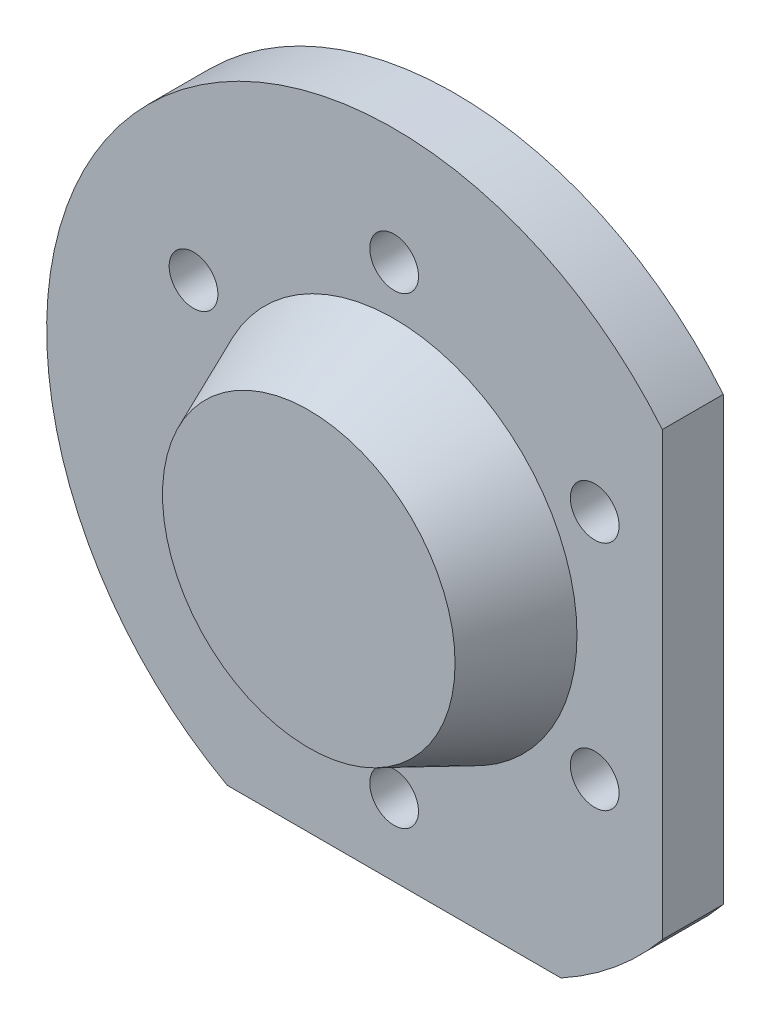
ISO-10303-21;
HEADER;
FILE_DESCRIPTION(('STEP AP214'),'2;1');
FILE_NAME('part.step','',(''),(''),'','','');
FILE_SCHEMA(('AUTOMOTIVE_DESIGN { 1 0 10303 214 1 1 1 1 }'));
ENDSEC;
DATA;
#1=APPLICATION_CONTEXT('core data for automotive mechanical design processes');
#2=APPLICATION_PROTOCOL_DEFINITION('international standard','automotive_design',2000,#1);
#3=PRODUCT_CONTEXT('',#1,'mechanical');
#4=PRODUCT('Part','Part','',(#3));
#5=PRODUCT_RELATED_PRODUCT_CATEGORY('part','',(#4));
#6=PRODUCT_DEFINITION_FORMATION('','',#4);
#7=PRODUCT_DEFINITION_CONTEXT('part definition',#1,'design');
#8=PRODUCT_DEFINITION('design','',#6,#7);
#9=PRODUCT_DEFINITION_SHAPE('','',#8);
#10=(LENGTH_UNIT() NAMED_UNIT(*) SI_UNIT(.MILLI.,.METRE.));
#11=(NAMED_UNIT(*) PLANE_ANGLE_UNIT() SI_UNIT($,.RADIAN.));
#12=(NAMED_UNIT(*) SI_UNIT($,.STERADIAN.) SOLID_ANGLE_UNIT());
#13=UNCERTAINTY_MEASURE_WITH_UNIT(LENGTH_MEASURE(1.E-05),#10,'distance_accuracy_value','');
#14=(GEOMETRIC_REPRESENTATION_CONTEXT(3) GLOBAL_UNCERTAINTY_ASSIGNED_CONTEXT((#13)) GLOBAL_UNIT_ASSIGNED_CONTEXT((#10,
#11,#12)) REPRESENTATION_CONTEXT('',''));
#15=CARTESIAN_POINT('',(0.,0.,0.));
#16=DIRECTION('',(0.,0.,1.));
#17=DIRECTION('',(1.,0.,0.));
#18=AXIS2_PLACEMENT_3D('',#15,#16,#17);
#19=CARTESIAN_POINT('',(0.,0.,0.));
#20=DIRECTION('',(0.,0.,1.));
#21=DIRECTION('',(1.,0.,0.));
#22=AXIS2_PLACEMENT_3D('',#19,#20,#21);
#23=PLANE('',#22);
#24=CARTESIAN_POINT('',(0.,0.,0.));
#25=DIRECTION('',(0.,0.,1.));
#26=DIRECTION('',(1.,0.,0.));
#27=AXIS2_PLACEMENT_3D('',#24,#25,#26);
#28=CIRCLE('',#27,28.5);
#29=CARTESIAN_POINT('',(22.,18.1176709319934,0.));
#30=VERTEX_POINT('',#29);
#31=CARTESIAN_POINT('',(-13.683932183404,-25.,0.));
#32=VERTEX_POINT('',#31);
#33=EDGE_CURVE('E107',#30,#32,#28,.T.);
#34=ORIENTED_EDGE('',*,*,#33,.T.);
#35=DIRECTION('',(1.,0.,0.));
#36=VECTOR('',#35,1.);
#37=CARTESIAN_POINT('',(-13.683932183404,-25.,0.));
#38=LINE('',#37,#36);
#39=CARTESIAN_POINT('',(13.683932183404,-25.,0.));
#40=VERTEX_POINT('',#39);
#41=EDGE_CURVE('E110',#32,#40,#38,.T.);
#42=ORIENTED_EDGE('',*,*,#41,.T.);
#43=CARTESIAN_POINT('',(0.,0.,0.));
#44=DIRECTION('',(0.,0.,1.));
#45=DIRECTION('',(1.,0.,0.));
#46=AXIS2_PLACEMENT_3D('',#43,#44,#45);
#47=CIRCLE('',#46,28.5);
#48=CARTESIAN_POINT('',(22.,-18.1176709319935,0.));
#49=VERTEX_POINT('',#48);
#50=EDGE_CURVE('E91',#40,#49,#47,.T.);
#51=ORIENTED_EDGE('',*,*,#50,.T.);
#52=DIRECTION('',(0.,1.,0.));
#53=VECTOR('',#52,1.);
#54=CARTESIAN_POINT('',(22.,-18.1176709319934,0.));
#55=LINE('',#54,#53);
#56=EDGE_CURVE('E102',#49,#30,#55,.T.);
#57=ORIENTED_EDGE('',*,*,#56,.T.);
#58=EDGE_LOOP('',(#34,#42,#51,#57));
#59=FACE_BOUND('',#58,.T.);
#60=CARTESIAN_POINT('',(0.,19.,0.));
#61=DIRECTION('',(0.,0.,1.));
#62=DIRECTION('',(1.,0.,0.));
#63=AXIS2_PLACEMENT_3D('',#60,#61,#62);
#64=CIRCLE('',#63,2.);
#65=CARTESIAN_POINT('',(2.,19.,0.));
#66=VERTEX_POINT('',#65);
#67=EDGE_CURVE('E166',#66,#66,#64,.T.);
#68=ORIENTED_EDGE('',*,*,#67,.F.);
#69=EDGE_LOOP('',(#68));
#70=FACE_BOUND('',#69,.T.);
#71=CARTESIAN_POINT('',(16.4544826719043,9.50000000000001,0.));
#72=DIRECTION('',(0.,0.,1.));
#73=DIRECTION('',(1.,0.,0.));
#74=AXIS2_PLACEMENT_3D('',#71,#72,#73);
#75=CIRCLE('',#74,2.);
#76=CARTESIAN_POINT('',(18.4544826719043,9.50000000000001,0.));
#77=VERTEX_POINT('',#76);
#78=EDGE_CURVE('E160',#77,#77,#75,.T.);
#79=ORIENTED_EDGE('',*,*,#78,.F.);
#80=EDGE_LOOP('',(#79));
#81=FACE_BOUND('',#80,.T.);
#82=CARTESIAN_POINT('',(16.4544826719043,-9.5,0.));
#83=DIRECTION('',(0.,0.,1.));
#84=DIRECTION('',(1.,0.,0.));
#85=AXIS2_PLACEMENT_3D('',#82,#83,#84);
#86=CIRCLE('',#85,2.);
#87=CARTESIAN_POINT('',(18.4544826719043,-9.5,0.));
#88=VERTEX_POINT('',#87);
#89=EDGE_CURVE('E154',#88,#88,#86,.T.);
#90=ORIENTED_EDGE('',*,*,#89,.F.);
#91=EDGE_LOOP('',(#90));
#92=FACE_BOUND('',#91,.T.);
#93=CARTESIAN_POINT('',(0.,-19.,0.));
#94=DIRECTION('',(0.,0.,1.));
#95=DIRECTION('',(1.,0.,0.));
#96=AXIS2_PLACEMENT_3D('',#93,#94,#95);
#97=CIRCLE('',#96,2.);
#98=CARTESIAN_POINT('',(2.,-19.,0.));
#99=VERTEX_POINT('',#98);
#100=EDGE_CURVE('E148',#99,#99,#97,.T.);
#101=ORIENTED_EDGE('',*,*,#100,.F.);
#102=EDGE_LOOP('',(#101));
#103=FACE_BOUND('',#102,.T.);
#104=CARTESIAN_POINT('',(-16.4544826719043,-9.50000000000001,0.));
#105=DIRECTION('',(0.,0.,1.));
#106=DIRECTION('',(1.,0.,0.));
#107=AXIS2_PLACEMENT_3D('',#104,#105,#106);
#108=CIRCLE('',#107,2.);
#109=CARTESIAN_POINT('',(-14.4544826719043,-9.50000000000001,0.));
#110=VERTEX_POINT('',#109);
#111=EDGE_CURVE('E142',#110,#110,#108,.T.);
#112=ORIENTED_EDGE('',*,*,#111,.F.);
#113=EDGE_LOOP('',(#112));
#114=FACE_BOUND('',#113,.T.);
#115=CARTESIAN_POINT('',(-16.4544826719043,9.49999999999999,0.));
#116=DIRECTION('',(0.,0.,1.));
#117=DIRECTION('',(1.,0.,0.));
#118=AXIS2_PLACEMENT_3D('',#115,#116,#117);
#119=CIRCLE('',#118,2.);
#120=CARTESIAN_POINT('',(-14.4544826719043,9.49999999999999,0.));
#121=VERTEX_POINT('',#120);
#122=EDGE_CURVE('E138',#121,#121,#119,.T.);
#123=ORIENTED_EDGE('',*,*,#122,.F.);
#124=EDGE_LOOP('',(#123));
#125=FACE_BOUND('',#124,.T.);
#126=CARTESIAN_POINT('',(0.,0.,0.));
#127=DIRECTION('',(0.,0.,1.));
#128=DIRECTION('',(1.,0.,0.));
#129=AXIS2_PLACEMENT_3D('',#126,#127,#128);
#130=CIRCLE('',#129,15.);
#131=CARTESIAN_POINT('',(15.,0.,0.));
#132=VERTEX_POINT('',#131);
#133=EDGE_CURVE('E120',#132,#132,#130,.T.);
#134=ORIENTED_EDGE('',*,*,#133,.F.);
#135=EDGE_LOOP('',(#134));
#136=FACE_BOUND('',#135,.T.);
#137=ADVANCED_FACE('F37',(#59,#70,#81,#92,#103,#114,#125,#136),#23,.T.);
#138=CARTESIAN_POINT('',(0.,0.,-5.));
#139=DIRECTION('',(0.,0.,1.));
#140=DIRECTION('',(1.,0.,0.));
#141=AXIS2_PLACEMENT_3D('',#138,#139,#140);
#142=CYLINDRICAL_SURFACE('',#141,28.5);
#143=ORIENTED_EDGE('',*,*,#33,.F.);
#144=DIRECTION('',(0.,0.,1.));
#145=VECTOR('',#144,1.);
#146=CARTESIAN_POINT('',(22.,18.1176709319934,-5.));
#147=LINE('',#146,#145);
#148=CARTESIAN_POINT('',(22.,18.1176709319934,-5.));
#149=VERTEX_POINT('',#148);
#150=EDGE_CURVE('E12',#149,#30,#147,.T.);
#151=ORIENTED_EDGE('',*,*,#150,.F.);
#152=CARTESIAN_POINT('',(0.,0.,-5.));
#153=DIRECTION('',(0.,0.,1.));
#154=DIRECTION('',(1.,0.,0.));
#155=AXIS2_PLACEMENT_3D('',#152,#153,#154);
#156=CIRCLE('',#155,28.5);
#157=CARTESIAN_POINT('',(-13.683932183404,-25.,-5.));
#158=VERTEX_POINT('',#157);
#159=EDGE_CURVE('E100',#149,#158,#156,.T.);
#160=ORIENTED_EDGE('',*,*,#159,.T.);
#161=DIRECTION('',(0.,0.,1.));
#162=VECTOR('',#161,1.);
#163=CARTESIAN_POINT('',(-13.683932183404,-25.,-5.));
#164=LINE('',#163,#162);
#165=EDGE_CURVE('E83',#158,#32,#164,.T.);
#166=ORIENTED_EDGE('',*,*,#165,.T.);
#167=EDGE_LOOP('',(#143,#151,#160,#166));
#168=FACE_BOUND('',#167,.T.);
#169=ADVANCED_FACE('F39',(#168),#142,.T.);
#170=CARTESIAN_POINT('',(22.,-18.1176709319934,-5.));
#171=DIRECTION('',(1.,0.,0.));
#172=DIRECTION('',(0.,0.,-1.));
#173=AXIS2_PLACEMENT_3D('',#170,#171,#172);
#174=PLANE('',#173);
#175=ORIENTED_EDGE('',*,*,#56,.F.);
#176=DIRECTION('',(0.,0.,1.));
#177=VECTOR('',#176,1.);
#178=CARTESIAN_POINT('',(22.,-18.1176709319935,-5.));
#179=LINE('',#178,#177);
#180=CARTESIAN_POINT('',(22.,-18.1176709319935,-5.));
#181=VERTEX_POINT('',#180);
#182=EDGE_CURVE('E49',#181,#49,#179,.T.);
#183=ORIENTED_EDGE('',*,*,#182,.F.);
#184=DIRECTION('',(0.,1.,0.));
#185=VECTOR('',#184,1.);
#186=CARTESIAN_POINT('',(22.,-18.1176709319934,-5.));
#187=LINE('',#186,#185);
#188=EDGE_CURVE('E97',#181,#149,#187,.T.);
#189=ORIENTED_EDGE('',*,*,#188,.T.);
#190=ORIENTED_EDGE('',*,*,#150,.T.);
#191=EDGE_LOOP('',(#175,#183,#189,#190));
#192=FACE_BOUND('',#191,.T.);
#193=ADVANCED_FACE('F225',(#192),#174,.T.);
#194=CARTESIAN_POINT('',(0.,0.,-5.));
#195=DIRECTION('',(0.,0.,1.));
#196=DIRECTION('',(1.,0.,0.));
#197=AXIS2_PLACEMENT_3D('',#194,#195,#196);
#198=CYLINDRICAL_SURFACE('',#197,28.5);
#199=ORIENTED_EDGE('',*,*,#50,.F.);
#200=DIRECTION('',(0.,0.,1.));
#201=VECTOR('',#200,1.);
#202=CARTESIAN_POINT('',(13.683932183404,-25.,-5.));
#203=LINE('',#202,#201);
#204=CARTESIAN_POINT('',(13.683932183404,-25.,-5.));
#205=VERTEX_POINT('',#204);
#206=EDGE_CURVE('E86',#205,#40,#203,.T.);
#207=ORIENTED_EDGE('',*,*,#206,.F.);
#208=CARTESIAN_POINT('',(0.,0.,-5.));
#209=DIRECTION('',(0.,0.,1.));
#210=DIRECTION('',(1.,0.,0.));
#211=AXIS2_PLACEMENT_3D('',#208,#209,#210);
#212=CIRCLE('',#211,28.5);
#213=EDGE_CURVE('E89',#205,#181,#212,.T.);
#214=ORIENTED_EDGE('',*,*,#213,.T.);
#215=ORIENTED_EDGE('',*,*,#182,.T.);
#216=EDGE_LOOP('',(#199,#207,#214,#215));
#217=FACE_BOUND('',#216,.T.);
#218=ADVANCED_FACE('F88',(#217),#198,.T.);
#219=CARTESIAN_POINT('',(-13.683932183404,-25.,-5.));
#220=DIRECTION('',(0.,-1.,0.));
#221=DIRECTION('',(0.,0.,-1.));
#222=AXIS2_PLACEMENT_3D('',#219,#220,#221);
#223=PLANE('',#222);
#224=ORIENTED_EDGE('',*,*,#41,.F.);
#225=ORIENTED_EDGE('',*,*,#165,.F.);
#226=DIRECTION('',(1.,0.,0.));
#227=VECTOR('',#226,1.);
#228=CARTESIAN_POINT('',(-13.683932183404,-25.,-5.));
#229=LINE('',#228,#227);
#230=EDGE_CURVE('E96',#158,#205,#229,.T.);
#231=ORIENTED_EDGE('',*,*,#230,.T.);
#232=ORIENTED_EDGE('',*,*,#206,.T.);
#233=EDGE_LOOP('',(#224,#225,#231,#232));
#234=FACE_BOUND('',#233,.T.);
#235=ADVANCED_FACE('F99',(#234),#223,.T.);
#236=CARTESIAN_POINT('',(0.,0.,-5.));
#237=DIRECTION('',(0.,0.,1.));
#238=DIRECTION('',(1.,0.,0.));
#239=AXIS2_PLACEMENT_3D('',#236,#237,#238);
#240=PLANE('',#239);
#241=CARTESIAN_POINT('',(-16.4544826719043,9.49999999999999,-5.));
#242=DIRECTION('',(0.,0.,1.));
#243=DIRECTION('',(1.,0.,0.));
#244=AXIS2_PLACEMENT_3D('',#241,#242,#243);
#245=CIRCLE('',#244,2.);
#246=CARTESIAN_POINT('',(-14.4544826719043,9.49999999999999,-5.));
#247=VERTEX_POINT('',#246);
#248=EDGE_CURVE('E139',#247,#247,#245,.T.);
#249=ORIENTED_EDGE('',*,*,#248,.T.);
#250=EDGE_LOOP('',(#249));
#251=FACE_BOUND('',#250,.T.);
#252=CARTESIAN_POINT('',(-16.4544826719043,-9.50000000000001,-5.));
#253=DIRECTION('',(0.,0.,1.));
#254=DIRECTION('',(1.,0.,0.));
#255=AXIS2_PLACEMENT_3D('',#252,#253,#254);
#256=CIRCLE('',#255,2.);
#257=CARTESIAN_POINT('',(-14.4544826719043,-9.50000000000001,-5.));
#258=VERTEX_POINT('',#257);
#259=EDGE_CURVE('E145',#258,#258,#256,.T.);
#260=ORIENTED_EDGE('',*,*,#259,.T.);
#261=EDGE_LOOP('',(#260));
#262=FACE_BOUND('',#261,.T.);
#263=CARTESIAN_POINT('',(0.,-19.,-5.));
#264=DIRECTION('',(0.,0.,1.));
#265=DIRECTION('',(1.,0.,0.));
#266=AXIS2_PLACEMENT_3D('',#263,#264,#265);
#267=CIRCLE('',#266,2.);
#268=CARTESIAN_POINT('',(2.,-19.,-5.));
#269=VERTEX_POINT('',#268);
#270=EDGE_CURVE('E151',#269,#269,#267,.T.);
#271=ORIENTED_EDGE('',*,*,#270,.T.);
#272=EDGE_LOOP('',(#271));
#273=FACE_BOUND('',#272,.T.);
#274=CARTESIAN_POINT('',(16.4544826719043,-9.5,-5.));
#275=DIRECTION('',(0.,0.,1.));
#276=DIRECTION('',(1.,0.,0.));
#277=AXIS2_PLACEMENT_3D('',#274,#275,#276);
#278=CIRCLE('',#277,2.);
#279=CARTESIAN_POINT('',(18.4544826719043,-9.5,-5.));
#280=VERTEX_POINT('',#279);
#281=EDGE_CURVE('E157',#280,#280,#278,.T.);
#282=ORIENTED_EDGE('',*,*,#281,.T.);
#283=EDGE_LOOP('',(#282));
#284=FACE_BOUND('',#283,.T.);
#285=CARTESIAN_POINT('',(16.4544826719043,9.50000000000001,-5.));
#286=DIRECTION('',(0.,0.,1.));
#287=DIRECTION('',(1.,0.,0.));
#288=AXIS2_PLACEMENT_3D('',#285,#286,#287);
#289=CIRCLE('',#288,2.);
#290=CARTESIAN_POINT('',(18.4544826719043,9.50000000000001,-5.));
#291=VERTEX_POINT('',#290);
#292=EDGE_CURVE('E163',#291,#291,#289,.T.);
#293=ORIENTED_EDGE('',*,*,#292,.T.);
#294=EDGE_LOOP('',(#293));
#295=FACE_BOUND('',#294,.T.);
#296=CARTESIAN_POINT('',(0.,19.,-5.));
#297=DIRECTION('',(0.,0.,1.));
#298=DIRECTION('',(1.,0.,0.));
#299=AXIS2_PLACEMENT_3D('',#296,#297,#298);
#300=CIRCLE('',#299,2.);
#301=CARTESIAN_POINT('',(2.,19.,-5.));
#302=VERTEX_POINT('',#301);
#303=EDGE_CURVE('E111',#302,#302,#300,.T.);
#304=ORIENTED_EDGE('',*,*,#303,.T.);
#305=EDGE_LOOP('',(#304));
#306=FACE_BOUND('',#305,.T.);
#307=CARTESIAN_POINT('',(0.,0.,-5.));
#308=DIRECTION('',(0.,0.,1.));
#309=DIRECTION('',(1.,0.,0.));
#310=AXIS2_PLACEMENT_3D('',#307,#308,#309);
#311=CIRCLE('',#310,15.);
#312=CARTESIAN_POINT('',(15.,0.,-5.));
#313=VERTEX_POINT('',#312);
#314=EDGE_CURVE('E127',#313,#313,#311,.T.);
#315=ORIENTED_EDGE('',*,*,#314,.T.);
#316=EDGE_LOOP('',(#315));
#317=FACE_BOUND('',#316,.T.);
#318=ORIENTED_EDGE('',*,*,#159,.F.);
#319=ORIENTED_EDGE('',*,*,#188,.F.);
#320=ORIENTED_EDGE('',*,*,#213,.F.);
#321=ORIENTED_EDGE('',*,*,#230,.F.);
#322=EDGE_LOOP('',(#318,#319,#320,#321));
#323=FACE_BOUND('',#322,.T.);
#324=ADVANCED_FACE('F95',(#251,#262,#273,#284,#295,#306,#317,#323),#240,.F.);
#325=CARTESIAN_POINT('',(0.,19.,-5.));
#326=DIRECTION('',(0.,0.,1.));
#327=DIRECTION('',(1.,0.,0.));
#328=AXIS2_PLACEMENT_3D('',#325,#326,#327);
#329=CYLINDRICAL_SURFACE('',#328,2.);
#330=ORIENTED_EDGE('',*,*,#303,.F.);
#331=EDGE_LOOP('',(#330));
#332=FACE_BOUND('',#331,.T.);
#333=ORIENTED_EDGE('',*,*,#67,.T.);
#334=EDGE_LOOP('',(#333));
#335=FACE_BOUND('',#334,.T.);
#336=ADVANCED_FACE('F173',(#332,#335),#329,.F.);
#337=CARTESIAN_POINT('',(16.4544826719043,9.50000000000001,-5.));
#338=DIRECTION('',(0.,0.,1.));
#339=DIRECTION('',(1.,0.,0.));
#340=AXIS2_PLACEMENT_3D('',#337,#338,#339);
#341=CYLINDRICAL_SURFACE('',#340,2.);
#342=ORIENTED_EDGE('',*,*,#292,.F.);
#343=EDGE_LOOP('',(#342));
#344=FACE_BOUND('',#343,.T.);
#345=ORIENTED_EDGE('',*,*,#78,.T.);
#346=EDGE_LOOP('',(#345));
#347=FACE_BOUND('',#346,.T.);
#348=ADVANCED_FACE('F213',(#344,#347),#341,.F.);
#349=CARTESIAN_POINT('',(16.4544826719043,-9.5,-5.));
#350=DIRECTION('',(0.,0.,1.));
#351=DIRECTION('',(1.,0.,0.));
#352=AXIS2_PLACEMENT_3D('',#349,#350,#351);
#353=CYLINDRICAL_SURFACE('',#352,2.);
#354=ORIENTED_EDGE('',*,*,#281,.F.);
#355=EDGE_LOOP('',(#354));
#356=FACE_BOUND('',#355,.T.);
#357=ORIENTED_EDGE('',*,*,#89,.T.);
#358=EDGE_LOOP('',(#357));
#359=FACE_BOUND('',#358,.T.);
#360=ADVANCED_FACE('F209',(#356,#359),#353,.F.);
#361=CARTESIAN_POINT('',(0.,-19.,-5.));
#362=DIRECTION('',(0.,0.,1.));
#363=DIRECTION('',(1.,0.,0.));
#364=AXIS2_PLACEMENT_3D('',#361,#362,#363);
#365=CYLINDRICAL_SURFACE('',#364,2.);
#366=ORIENTED_EDGE('',*,*,#270,.F.);
#367=EDGE_LOOP('',(#366));
#368=FACE_BOUND('',#367,.T.);
#369=ORIENTED_EDGE('',*,*,#100,.T.);
#370=EDGE_LOOP('',(#369));
#371=FACE_BOUND('',#370,.T.);
#372=ADVANCED_FACE('F201',(#368,#371),#365,.F.);
#373=CARTESIAN_POINT('',(-16.4544826719043,-9.50000000000001,-5.));
#374=DIRECTION('',(0.,0.,1.));
#375=DIRECTION('',(1.,0.,0.));
#376=AXIS2_PLACEMENT_3D('',#373,#374,#375);
#377=CYLINDRICAL_SURFACE('',#376,2.);
#378=ORIENTED_EDGE('',*,*,#259,.F.);
#379=EDGE_LOOP('',(#378));
#380=FACE_BOUND('',#379,.T.);
#381=ORIENTED_EDGE('',*,*,#111,.T.);
#382=EDGE_LOOP('',(#381));
#383=FACE_BOUND('',#382,.T.);
#384=ADVANCED_FACE('F191',(#380,#383),#377,.F.);
#385=CARTESIAN_POINT('',(-16.4544826719043,9.49999999999999,-5.));
#386=DIRECTION('',(0.,0.,1.));
#387=DIRECTION('',(1.,0.,0.));
#388=AXIS2_PLACEMENT_3D('',#385,#386,#387);
#389=CYLINDRICAL_SURFACE('',#388,2.);
#390=ORIENTED_EDGE('',*,*,#248,.F.);
#391=EDGE_LOOP('',(#390));
#392=FACE_BOUND('',#391,.T.);
#393=ORIENTED_EDGE('',*,*,#122,.T.);
#394=EDGE_LOOP('',(#393));
#395=FACE_BOUND('',#394,.T.);
#396=ADVANCED_FACE('F188',(#392,#395),#389,.F.);
#397=CARTESIAN_POINT('',(0.,0.,-6.));
#398=DIRECTION('',(0.,0.,1.));
#399=DIRECTION('',(1.,0.,0.));
#400=AXIS2_PLACEMENT_3D('',#397,#398,#399);
#401=CYLINDRICAL_SURFACE('',#400,15.);
#402=CARTESIAN_POINT('',(0.,0.,-6.));
#403=DIRECTION('',(0.,0.,1.));
#404=DIRECTION('',(1.,0.,0.));
#405=AXIS2_PLACEMENT_3D('',#402,#403,#404);
#406=CIRCLE('',#405,15.);
#407=CARTESIAN_POINT('',(15.,0.,-6.));
#408=VERTEX_POINT('',#407);
#409=EDGE_CURVE('E123',#408,#408,#406,.T.);
#410=ORIENTED_EDGE('',*,*,#409,.T.);
#411=EDGE_LOOP('',(#410));
#412=FACE_BOUND('',#411,.T.);
#413=ORIENTED_EDGE('',*,*,#314,.F.);
#414=EDGE_LOOP('',(#413));
#415=FACE_BOUND('',#414,.T.);
#416=ADVANCED_FACE('F190',(#412,#415),#401,.T.);
#417=CARTESIAN_POINT('',(0.,0.,-6.));
#418=DIRECTION('',(0.,0.,1.));
#419=DIRECTION('',(1.,0.,0.));
#420=AXIS2_PLACEMENT_3D('',#417,#418,#419);
#421=PLANE('',#420);
#422=ORIENTED_EDGE('',*,*,#409,.F.);
#423=EDGE_LOOP('',(#422));
#424=FACE_BOUND('',#423,.T.);
#425=ADVANCED_FACE('F198',(#424),#421,.F.);
#426=CARTESIAN_POINT('',(0.,0.,7.));
#427=DIRECTION('',(0.,0.,1.));
#428=DIRECTION('',(1.,0.,0.));
#429=AXIS2_PLACEMENT_3D('',#426,#427,#428);
#430=PLANE('',#429);
#431=CARTESIAN_POINT('',(0.,0.,7.));
#432=DIRECTION('',(0.,0.,1.));
#433=DIRECTION('',(1.,0.,0.));
#434=AXIS2_PLACEMENT_3D('',#431,#432,#433);
#435=CIRCLE('',#434,12.);
#436=CARTESIAN_POINT('',(12.,0.,7.));
#437=VERTEX_POINT('',#436);
#438=EDGE_CURVE('E124',#437,#437,#435,.T.);
#439=ORIENTED_EDGE('',*,*,#438,.T.);
#440=EDGE_LOOP('',(#439));
#441=FACE_BOUND('',#440,.T.);
#442=ADVANCED_FACE('F277',(#441),#430,.T.);
#443=CARTESIAN_POINT('',(0.,0.,7.));
#444=DIRECTION('',(0.,0.,-1.));
#445=DIRECTION('',(-1.,0.,0.));
#446=AXIS2_PLACEMENT_3D('',#443,#444,#445);
#447=CONICAL_SURFACE('',#446,12.,0.404891786285083);
#448=ORIENTED_EDGE('',*,*,#438,.F.);
#449=EDGE_LOOP('',(#448));
#450=FACE_BOUND('',#449,.T.);
#451=ORIENTED_EDGE('',*,*,#133,.T.);
#452=EDGE_LOOP('',(#451));
#453=FACE_BOUND('',#452,.T.);
#454=ADVANCED_FACE('F294',(#450,#453),#447,.T.);
#455=CLOSED_SHELL('',(#137,#169,#193,#218,#235,#324,#336,#348,#360,#372,#384,#396,#416,#425,
#442,#454));
#456=MANIFOLD_SOLID_BREP('B2',#455);
#457=ADVANCED_BREP_SHAPE_REPRESENTATION('',(#18,#456),#14);
#458=SHAPE_DEFINITION_REPRESENTATION(#9,#457);
ENDSEC;
END-ISO-10303-21;
